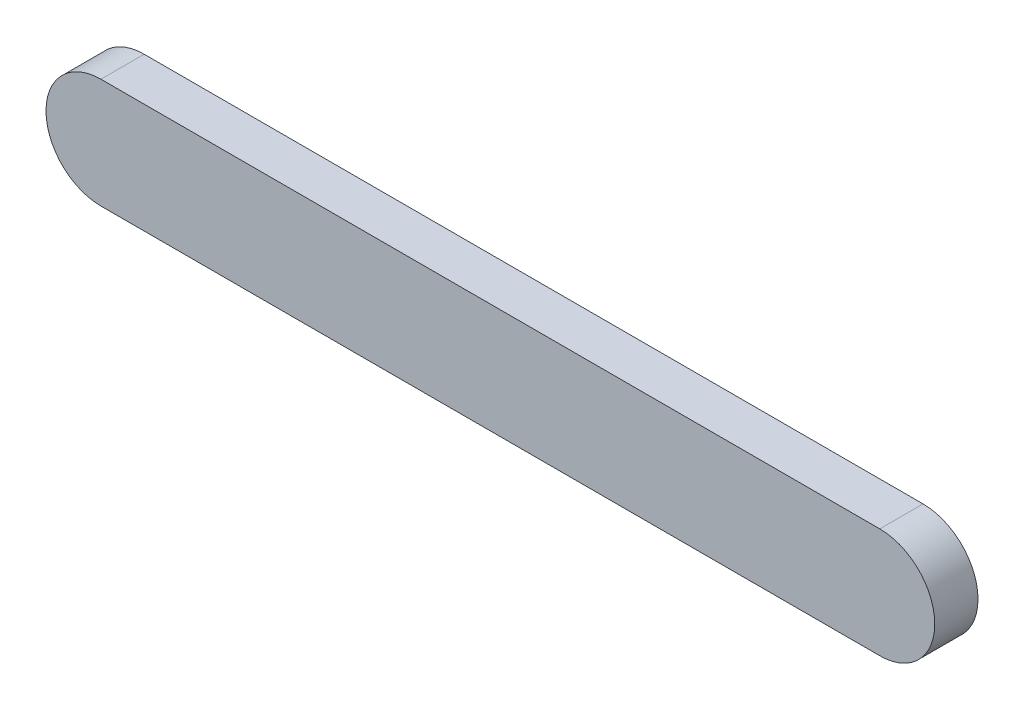
ISO-10303-21;
HEADER;
FILE_DESCRIPTION(('STEP AP214'),'2;1');
FILE_NAME('part.step','',(''),(''),'','','');
FILE_SCHEMA(('AUTOMOTIVE_DESIGN { 1 0 10303 214 1 1 1 1 }'));
ENDSEC;
DATA;
#1=APPLICATION_CONTEXT('core data for automotive mechanical design processes');
#2=APPLICATION_PROTOCOL_DEFINITION('international standard','automotive_design',2000,#1);
#3=PRODUCT_CONTEXT('',#1,'mechanical');
#4=PRODUCT('Part','Part','',(#3));
#5=PRODUCT_RELATED_PRODUCT_CATEGORY('part','',(#4));
#6=PRODUCT_DEFINITION_FORMATION('','',#4);
#7=PRODUCT_DEFINITION_CONTEXT('part definition',#1,'design');
#8=PRODUCT_DEFINITION('design','',#6,#7);
#9=PRODUCT_DEFINITION_SHAPE('','',#8);
#10=(LENGTH_UNIT() NAMED_UNIT(*) SI_UNIT(.MILLI.,.METRE.));
#11=(NAMED_UNIT(*) PLANE_ANGLE_UNIT() SI_UNIT($,.RADIAN.));
#12=(NAMED_UNIT(*) SI_UNIT($,.STERADIAN.) SOLID_ANGLE_UNIT());
#13=UNCERTAINTY_MEASURE_WITH_UNIT(LENGTH_MEASURE(1.E-05),#10,'distance_accuracy_value','');
#14=(GEOMETRIC_REPRESENTATION_CONTEXT(3) GLOBAL_UNCERTAINTY_ASSIGNED_CONTEXT((#13)) GLOBAL_UNIT_ASSIGNED_CONTEXT((#10,
#11,#12)) REPRESENTATION_CONTEXT('',''));
#15=CARTESIAN_POINT('',(0.,0.,0.));
#16=DIRECTION('',(0.,0.,1.));
#17=DIRECTION('',(1.,0.,0.));
#18=AXIS2_PLACEMENT_3D('',#15,#16,#17);
#19=CARTESIAN_POINT('',(133.6483992,63.9826,0.));
#20=DIRECTION('',(0.,1.,0.));
#21=DIRECTION('',(1.,0.,0.));
#22=AXIS2_PLACEMENT_3D('',#19,#20,#21);
#23=PLANE('',#22);
#24=DIRECTION('',(1.,0.,0.));
#25=VECTOR('',#24,1.);
#26=CARTESIAN_POINT('',(133.6483992,63.9826,0.1999996));
#27=LINE('',#26,#25);
#28=CARTESIAN_POINT('',(133.6483992,63.9826,0.1999996));
#29=VERTEX_POINT('',#28);
#30=CARTESIAN_POINT('',(137.24934196,63.9826,0.1999996));
#31=VERTEX_POINT('',#30);
#32=EDGE_CURVE('E11',#29,#31,#27,.T.);
#33=ORIENTED_EDGE('',*,*,#32,.F.);
#34=DIRECTION('',(0.,0.,1.));
#35=VECTOR('',#34,1.);
#36=CARTESIAN_POINT('',(133.6483992,63.9826,0.));
#37=LINE('',#36,#35);
#38=CARTESIAN_POINT('',(133.6483992,63.9826,0.));
#39=VERTEX_POINT('',#38);
#40=EDGE_CURVE('E24',#39,#29,#37,.T.);
#41=ORIENTED_EDGE('',*,*,#40,.F.);
#42=DIRECTION('',(1.,0.,0.));
#43=VECTOR('',#42,1.);
#44=CARTESIAN_POINT('',(133.6483992,63.9826,0.));
#45=LINE('',#44,#43);
#46=CARTESIAN_POINT('',(137.24934196,63.9826,0.));
#47=VERTEX_POINT('',#46);
#48=EDGE_CURVE('E75',#39,#47,#45,.T.);
#49=ORIENTED_EDGE('',*,*,#48,.T.);
#50=DIRECTION('',(0.,0.,1.));
#51=VECTOR('',#50,1.);
#52=CARTESIAN_POINT('',(137.24934196,63.9826,0.));
#53=LINE('',#52,#51);
#54=EDGE_CURVE('E37',#47,#31,#53,.T.);
#55=ORIENTED_EDGE('',*,*,#54,.T.);
#56=EDGE_LOOP('',(#33,#41,#49,#55));
#57=FACE_BOUND('',#56,.T.);
#58=ADVANCED_FACE('F17',(#57),#23,.F.);
#59=CARTESIAN_POINT('',(137.24934196,64.2366,0.));
#60=DIRECTION('',(0.,0.,-1.));
#61=DIRECTION('',(-1.11896493820489E-13,-1.,0.));
#62=AXIS2_PLACEMENT_3D('',#59,#60,#61);
#63=CYLINDRICAL_SURFACE('',#62,0.253999999999998);
#64=CARTESIAN_POINT('',(137.24934196,64.2366,0.1999996));
#65=DIRECTION('',(0.,0.,1.));
#66=DIRECTION('',(-1.11896493820489E-13,-1.,0.));
#67=AXIS2_PLACEMENT_3D('',#64,#65,#66);
#68=CIRCLE('',#67,0.253999999999998);
#69=CARTESIAN_POINT('',(137.24934196,64.4906,0.1999996));
#70=VERTEX_POINT('',#69);
#71=EDGE_CURVE('E83',#31,#70,#68,.T.);
#72=ORIENTED_EDGE('',*,*,#71,.F.);
#73=ORIENTED_EDGE('',*,*,#54,.F.);
#74=CARTESIAN_POINT('',(137.24934196,64.2366,0.));
#75=DIRECTION('',(0.,0.,1.));
#76=DIRECTION('',(-1.11896493820489E-13,-1.,0.));
#77=AXIS2_PLACEMENT_3D('',#74,#75,#76);
#78=CIRCLE('',#77,0.253999999999998);
#79=CARTESIAN_POINT('',(137.24934196,64.4906,0.));
#80=VERTEX_POINT('',#79);
#81=EDGE_CURVE('E81',#47,#80,#78,.T.);
#82=ORIENTED_EDGE('',*,*,#81,.T.);
#83=DIRECTION('',(0.,0.,1.));
#84=VECTOR('',#83,1.);
#85=CARTESIAN_POINT('',(137.24934196,64.4906,0.));
#86=LINE('',#85,#84);
#87=EDGE_CURVE('E67',#80,#70,#86,.T.);
#88=ORIENTED_EDGE('',*,*,#87,.T.);
#89=EDGE_LOOP('',(#72,#73,#82,#88));
#90=FACE_BOUND('',#89,.T.);
#91=ADVANCED_FACE('F89',(#90),#63,.T.);
#92=CARTESIAN_POINT('',(137.24934196,64.4906,0.));
#93=DIRECTION('',(0.,-1.,0.));
#94=DIRECTION('',(-1.,0.,0.));
#95=AXIS2_PLACEMENT_3D('',#92,#93,#94);
#96=PLANE('',#95);
#97=DIRECTION('',(-1.,0.,0.));
#98=VECTOR('',#97,1.);
#99=CARTESIAN_POINT('',(137.24934196,64.4906,0.1999996));
#100=LINE('',#99,#98);
#101=CARTESIAN_POINT('',(133.6483992,64.4906,0.1999996));
#102=VERTEX_POINT('',#101);
#103=EDGE_CURVE('E71',#70,#102,#100,.T.);
#104=ORIENTED_EDGE('',*,*,#103,.F.);
#105=ORIENTED_EDGE('',*,*,#87,.F.);
#106=DIRECTION('',(-1.,0.,0.));
#107=VECTOR('',#106,1.);
#108=CARTESIAN_POINT('',(137.24934196,64.4906,0.));
#109=LINE('',#108,#107);
#110=CARTESIAN_POINT('',(133.6483992,64.4906,0.));
#111=VERTEX_POINT('',#110);
#112=EDGE_CURVE('E63',#80,#111,#109,.T.);
#113=ORIENTED_EDGE('',*,*,#112,.T.);
#114=DIRECTION('',(0.,0.,1.));
#115=VECTOR('',#114,1.);
#116=CARTESIAN_POINT('',(133.6483992,64.4906,0.));
#117=LINE('',#116,#115);
#118=EDGE_CURVE('E53',#111,#102,#117,.T.);
#119=ORIENTED_EDGE('',*,*,#118,.T.);
#120=EDGE_LOOP('',(#104,#105,#113,#119));
#121=FACE_BOUND('',#120,.T.);
#122=ADVANCED_FACE('F66',(#121),#96,.F.);
#123=CARTESIAN_POINT('',(133.6483992,64.2366,0.));
#124=DIRECTION('',(0.,0.,-1.));
#125=DIRECTION('',(0.,1.,0.));
#126=AXIS2_PLACEMENT_3D('',#123,#124,#125);
#127=CYLINDRICAL_SURFACE('',#126,0.253999999999998);
#128=CARTESIAN_POINT('',(133.6483992,64.2366,0.1999996));
#129=DIRECTION('',(0.,0.,1.));
#130=DIRECTION('',(0.,1.,0.));
#131=AXIS2_PLACEMENT_3D('',#128,#129,#130);
#132=CIRCLE('',#131,0.253999999999998);
#133=EDGE_CURVE('E59',#102,#29,#132,.T.);
#134=ORIENTED_EDGE('',*,*,#133,.F.);
#135=ORIENTED_EDGE('',*,*,#118,.F.);
#136=CARTESIAN_POINT('',(133.6483992,64.2366,0.));
#137=DIRECTION('',(0.,0.,1.));
#138=DIRECTION('',(0.,1.,0.));
#139=AXIS2_PLACEMENT_3D('',#136,#137,#138);
#140=CIRCLE('',#139,0.253999999999998);
#141=EDGE_CURVE('E57',#111,#39,#140,.T.);
#142=ORIENTED_EDGE('',*,*,#141,.T.);
#143=ORIENTED_EDGE('',*,*,#40,.T.);
#144=EDGE_LOOP('',(#134,#135,#142,#143));
#145=FACE_BOUND('',#144,.T.);
#146=ADVANCED_FACE('F55',(#145),#127,.T.);
#147=CARTESIAN_POINT('',(133.6483992,63.9826,0.));
#148=DIRECTION('',(0.,0.,-1.));
#149=DIRECTION('',(-1.,0.,0.));
#150=AXIS2_PLACEMENT_3D('',#147,#148,#149);
#151=PLANE('',#150);
#152=ORIENTED_EDGE('',*,*,#141,.F.);
#153=ORIENTED_EDGE('',*,*,#112,.F.);
#154=ORIENTED_EDGE('',*,*,#81,.F.);
#155=ORIENTED_EDGE('',*,*,#48,.F.);
#156=EDGE_LOOP('',(#152,#153,#154,#155));
#157=FACE_BOUND('',#156,.T.);
#158=ADVANCED_FACE('F74',(#157),#151,.T.);
#159=CARTESIAN_POINT('',(133.6483992,63.9826,0.1999996));
#160=DIRECTION('',(0.,0.,-1.));
#161=DIRECTION('',(-1.,0.,0.));
#162=AXIS2_PLACEMENT_3D('',#159,#160,#161);
#163=PLANE('',#162);
#164=ORIENTED_EDGE('',*,*,#32,.T.);
#165=ORIENTED_EDGE('',*,*,#71,.T.);
#166=ORIENTED_EDGE('',*,*,#103,.T.);
#167=ORIENTED_EDGE('',*,*,#133,.T.);
#168=EDGE_LOOP('',(#164,#165,#166,#167));
#169=FACE_BOUND('',#168,.T.);
#170=ADVANCED_FACE('F91',(#169),#163,.F.);
#171=CLOSED_SHELL('',(#58,#91,#122,#146,#158,#170));
#172=MANIFOLD_SOLID_BREP('B1',#171);
#173=ADVANCED_BREP_SHAPE_REPRESENTATION('',(#18,#172),#14);
#174=SHAPE_DEFINITION_REPRESENTATION(#9,#173);
ENDSEC;
END-ISO-10303-21;
